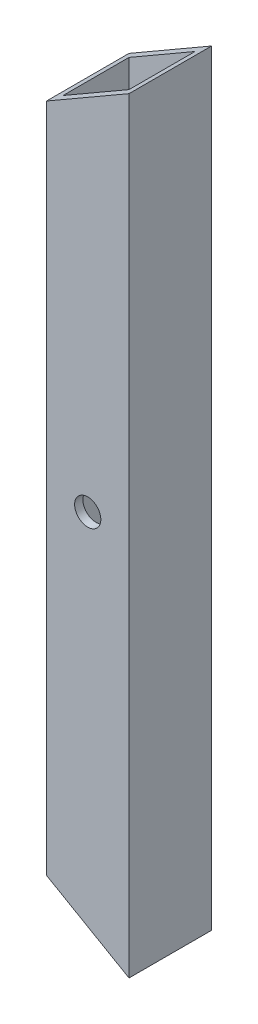
ISO-10303-21;
HEADER;
FILE_DESCRIPTION(('STEP AP214'),'2;1');
FILE_NAME('part.step','',(''),(''),'','','');
FILE_SCHEMA(('AUTOMOTIVE_DESIGN { 1 0 10303 214 1 1 1 1 }'));
ENDSEC;
DATA;
#1=APPLICATION_CONTEXT('core data for automotive mechanical design processes');
#2=APPLICATION_PROTOCOL_DEFINITION('international standard','automotive_design',2000,#1);
#3=PRODUCT_CONTEXT('',#1,'mechanical');
#4=PRODUCT('Part','Part','',(#3));
#5=PRODUCT_RELATED_PRODUCT_CATEGORY('part','',(#4));
#6=PRODUCT_DEFINITION_FORMATION('','',#4);
#7=PRODUCT_DEFINITION_CONTEXT('part definition',#1,'design');
#8=PRODUCT_DEFINITION('design','',#6,#7);
#9=PRODUCT_DEFINITION_SHAPE('','',#8);
#10=(LENGTH_UNIT() NAMED_UNIT(*) SI_UNIT(.MILLI.,.METRE.));
#11=(NAMED_UNIT(*) PLANE_ANGLE_UNIT() SI_UNIT($,.RADIAN.));
#12=(NAMED_UNIT(*) SI_UNIT($,.STERADIAN.) SOLID_ANGLE_UNIT());
#13=UNCERTAINTY_MEASURE_WITH_UNIT(LENGTH_MEASURE(1.E-05),#10,'distance_accuracy_value','');
#14=(GEOMETRIC_REPRESENTATION_CONTEXT(3) GLOBAL_UNCERTAINTY_ASSIGNED_CONTEXT((#13)) GLOBAL_UNIT_ASSIGNED_CONTEXT((#10,
#11,#12)) REPRESENTATION_CONTEXT('',''));
#15=CARTESIAN_POINT('',(0.,0.,0.));
#16=DIRECTION('',(0.,0.,1.));
#17=DIRECTION('',(1.,0.,0.));
#18=AXIS2_PLACEMENT_3D('',#15,#16,#17);
#19=CARTESIAN_POINT('',(239.29072497106,4.95437024738904E-12,26.9147395775252));
#20=DIRECTION('',(0.,0.,1.));
#21=DIRECTION('',(1.,0.,0.));
#22=AXIS2_PLACEMENT_3D('',#19,#20,#21);
#23=CYLINDRICAL_SURFACE('',#22,5.0419);
#24=CARTESIAN_POINT('',(239.29072497106,4.95437024738904E-12,28.575));
#25=DIRECTION('',(0.,0.,1.));
#26=DIRECTION('',(1.,0.,0.));
#27=AXIS2_PLACEMENT_3D('',#24,#25,#26);
#28=CIRCLE('',#27,5.0419);
#29=CARTESIAN_POINT('',(244.33262497106,4.95437024738904E-12,28.575));
#30=VERTEX_POINT('',#29);
#31=EDGE_CURVE('E119',#30,#30,#28,.T.);
#32=ORIENTED_EDGE('',*,*,#31,.F.);
#33=EDGE_LOOP('',(#32));
#34=FACE_BOUND('',#33,.T.);
#35=CARTESIAN_POINT('',(239.29072497106,4.95437024738904E-12,31.75));
#36=DIRECTION('',(0.,0.,1.));
#37=DIRECTION('',(1.,0.,0.));
#38=AXIS2_PLACEMENT_3D('',#35,#36,#37);
#39=CIRCLE('',#38,5.0419);
#40=CARTESIAN_POINT('',(244.33262497106,4.95437024738904E-12,31.75));
#41=VERTEX_POINT('',#40);
#42=EDGE_CURVE('E112',#41,#41,#39,.T.);
#43=ORIENTED_EDGE('',*,*,#42,.T.);
#44=EDGE_LOOP('',(#43));
#45=FACE_BOUND('',#44,.T.);
#46=ADVANCED_FACE('F17',(#34,#45),#23,.F.);
#47=CARTESIAN_POINT('',(239.29072497106,4.95437024738904E-12,26.9147395775252));
#48=DIRECTION('',(0.,0.,1.));
#49=DIRECTION('',(1.,0.,0.));
#50=AXIS2_PLACEMENT_3D('',#47,#48,#49);
#51=CYLINDRICAL_SURFACE('',#50,5.0419);
#52=CARTESIAN_POINT('',(239.29072497106,4.95437024738904E-12,0.));
#53=DIRECTION('',(0.,0.,1.));
#54=DIRECTION('',(1.,0.,0.));
#55=AXIS2_PLACEMENT_3D('',#52,#53,#54);
#56=CIRCLE('',#55,5.0419);
#57=CARTESIAN_POINT('',(244.33262497106,4.95437024738904E-12,0.));
#58=VERTEX_POINT('',#57);
#59=EDGE_CURVE('E121',#58,#58,#56,.T.);
#60=ORIENTED_EDGE('',*,*,#59,.F.);
#61=EDGE_LOOP('',(#60));
#62=FACE_BOUND('',#61,.T.);
#63=CARTESIAN_POINT('',(239.29072497106,4.95437024738904E-12,3.175));
#64=DIRECTION('',(0.,0.,1.));
#65=DIRECTION('',(1.,0.,0.));
#66=AXIS2_PLACEMENT_3D('',#63,#64,#65);
#67=CIRCLE('',#66,5.0419);
#68=CARTESIAN_POINT('',(244.33262497106,4.95437024738904E-12,3.175));
#69=VERTEX_POINT('',#68);
#70=EDGE_CURVE('E20',#69,#69,#67,.T.);
#71=ORIENTED_EDGE('',*,*,#70,.T.);
#72=EDGE_LOOP('',(#71));
#73=FACE_BOUND('',#72,.T.);
#74=ADVANCED_FACE('F135',(#62,#73),#51,.F.);
#75=CARTESIAN_POINT('',(223.415724971035,-500000.000000032,20.4770471900706));
#76=DIRECTION('',(-1.,0.,0.));
#77=DIRECTION('',(0.,0.,1.));
#78=AXIS2_PLACEMENT_3D('',#75,#76,#77);
#79=PLANE('',#78);
#80=DIRECTION('',(0.,0.,1.));
#81=VECTOR('',#80,1.);
#82=CARTESIAN_POINT('',(223.415724970858,128.989128953119,0.));
#83=LINE('',#82,#81);
#84=CARTESIAN_POINT('',(223.415724971033,128.989128953022,31.75));
#85=VERTEX_POINT('',#84);
#86=CARTESIAN_POINT('',(223.415724971005,128.989128952965,0.));
#87=VERTEX_POINT('',#86);
#88=EDGE_CURVE('E103',#85,#87,#83,.F.);
#89=ORIENTED_EDGE('',*,*,#88,.T.);
#90=DIRECTION('',(0.,1.,0.));
#91=VECTOR('',#90,1.);
#92=CARTESIAN_POINT('',(223.415724971111,-500000.000000032,0.));
#93=LINE('',#92,#91);
#94=CARTESIAN_POINT('',(223.415724971106,-128.98912895354,0.));
#95=VERTEX_POINT('',#94);
#96=EDGE_CURVE('E168',#95,#87,#93,.T.);
#97=ORIENTED_EDGE('',*,*,#96,.F.);
#98=DIRECTION('',(0.,0.,1.));
#99=VECTOR('',#98,1.);
#100=CARTESIAN_POINT('',(223.41572497125,-128.989128953345,0.));
#101=LINE('',#100,#99);
#102=CARTESIAN_POINT('',(223.415724971139,-128.989128953576,31.75));
#103=VERTEX_POINT('',#102);
#104=EDGE_CURVE('E164',#103,#95,#101,.F.);
#105=ORIENTED_EDGE('',*,*,#104,.F.);
#106=DIRECTION('',(0.,1.,0.));
#107=VECTOR('',#106,1.);
#108=CARTESIAN_POINT('',(223.415724971111,-500000.000000032,31.75));
#109=LINE('',#108,#107);
#110=EDGE_CURVE('E113',#103,#85,#109,.T.);
#111=ORIENTED_EDGE('',*,*,#110,.T.);
#112=EDGE_LOOP('',(#89,#97,#105,#111));
#113=FACE_BOUND('',#112,.T.);
#114=ADVANCED_FACE('F255',(#113),#79,.T.);
#115=CARTESIAN_POINT('',(237.348847091196,-500000.000000032,3.175));
#116=DIRECTION('',(0.,0.,-1.));
#117=DIRECTION('',(-1.,0.,0.));
#118=AXIS2_PLACEMENT_3D('',#115,#116,#117);
#119=PLANE('',#118);
#120=ORIENTED_EDGE('',*,*,#70,.F.);
#121=EDGE_LOOP('',(#120));
#122=FACE_BOUND('',#121,.T.);
#123=DIRECTION('',(0.,1.,0.));
#124=VECTOR('',#123,1.);
#125=CARTESIAN_POINT('',(251.99072497106,-500000.000000032,3.175));
#126=LINE('',#125,#124);
#127=CARTESIAN_POINT('',(251.990724970973,145.486912895044,3.175));
#128=VERTEX_POINT('',#127);
#129=CARTESIAN_POINT('',(251.990724971076,-145.486912895592,3.175));
#130=VERTEX_POINT('',#129);
#131=EDGE_CURVE('E101',#128,#130,#126,.F.);
#132=ORIENTED_EDGE('',*,*,#131,.F.);
#133=DIRECTION('',(0.866025403784429,0.500000000000017,0.));
#134=VECTOR('',#133,1.);
#135=CARTESIAN_POINT('',(127.58286248553,73.66,3.175));
#136=LINE('',#135,#134);
#137=CARTESIAN_POINT('',(226.59072497104,130.822216057713,3.175));
#138=VERTEX_POINT('',#137);
#139=EDGE_CURVE('E95',#128,#138,#136,.F.);
#140=ORIENTED_EDGE('',*,*,#139,.T.);
#141=DIRECTION('',(0.,1.,0.));
#142=VECTOR('',#141,1.);
#143=CARTESIAN_POINT('',(226.590724971035,-500000.000000032,3.175));
#144=LINE('',#143,#142);
#145=CARTESIAN_POINT('',(226.590724971127,-130.822216058214,3.175));
#146=VERTEX_POINT('',#145);
#147=EDGE_CURVE('E79',#138,#146,#144,.F.);
#148=ORIENTED_EDGE('',*,*,#147,.T.);
#149=DIRECTION('',(0.866025403784429,-0.500000000000017,0.));
#150=VECTOR('',#149,1.);
#151=CARTESIAN_POINT('',(127.58286248553,-73.66,3.175));
#152=LINE('',#151,#150);
#153=EDGE_CURVE('E161',#130,#146,#152,.F.);
#154=ORIENTED_EDGE('',*,*,#153,.F.);
#155=EDGE_LOOP('',(#132,#140,#148,#154));
#156=FACE_BOUND('',#155,.T.);
#157=ADVANCED_FACE('F100',(#122,#156),#119,.F.);
#158=CARTESIAN_POINT('',(226.590724971035,-500000.000000032,20.4770471900706));
#159=DIRECTION('',(-1.,0.,0.));
#160=DIRECTION('',(0.,0.,1.));
#161=AXIS2_PLACEMENT_3D('',#158,#159,#160);
#162=PLANE('',#161);
#163=ORIENTED_EDGE('',*,*,#147,.F.);
#164=DIRECTION('',(0.,0.,1.));
#165=VECTOR('',#164,1.);
#166=CARTESIAN_POINT('',(226.590724970861,130.822216057798,0.));
#167=LINE('',#166,#165);
#168=CARTESIAN_POINT('',(226.590724971015,130.822216057679,28.575));
#169=VERTEX_POINT('',#168);
#170=EDGE_CURVE('E83',#138,#169,#167,.T.);
#171=ORIENTED_EDGE('',*,*,#170,.T.);
#172=DIRECTION('',(0.,1.,0.));
#173=VECTOR('',#172,1.);
#174=CARTESIAN_POINT('',(226.590724971111,-500000.000000032,28.575));
#175=LINE('',#174,#173);
#176=CARTESIAN_POINT('',(226.590724971109,-130.822216058214,28.575));
#177=VERTEX_POINT('',#176);
#178=EDGE_CURVE('E88',#177,#169,#175,.T.);
#179=ORIENTED_EDGE('',*,*,#178,.F.);
#180=DIRECTION('',(0.,0.,1.));
#181=VECTOR('',#180,1.);
#182=CARTESIAN_POINT('',(226.590724971253,-130.822216058024,0.));
#183=LINE('',#182,#181);
#184=EDGE_CURVE('E84',#146,#177,#183,.T.);
#185=ORIENTED_EDGE('',*,*,#184,.F.);
#186=EDGE_LOOP('',(#163,#171,#179,#185));
#187=FACE_BOUND('',#186,.T.);
#188=ADVANCED_FACE('F81',(#187),#162,.F.);
#189=CARTESIAN_POINT('',(241.414785423032,-500000.000000032,28.575));
#190=DIRECTION('',(0.,0.,-1.));
#191=DIRECTION('',(-1.,0.,0.));
#192=AXIS2_PLACEMENT_3D('',#189,#190,#191);
#193=PLANE('',#192);
#194=ORIENTED_EDGE('',*,*,#31,.T.);
#195=EDGE_LOOP('',(#194));
#196=FACE_BOUND('',#195,.T.);
#197=DIRECTION('',(0.866025403784429,0.500000000000017,0.));
#198=VECTOR('',#197,1.);
#199=CARTESIAN_POINT('',(127.58286248553,73.66,28.575));
#200=LINE('',#199,#198);
#201=CARTESIAN_POINT('',(251.990724970971,145.486912895071,28.575));
#202=VERTEX_POINT('',#201);
#203=EDGE_CURVE('E98',#169,#202,#200,.T.);
#204=ORIENTED_EDGE('',*,*,#203,.T.);
#205=DIRECTION('',(0.,1.,0.));
#206=VECTOR('',#205,1.);
#207=CARTESIAN_POINT('',(251.99072497106,-500000.000000032,28.575));
#208=LINE('',#207,#206);
#209=CARTESIAN_POINT('',(251.990724971076,-145.486912895592,28.575));
#210=VERTEX_POINT('',#209);
#211=EDGE_CURVE('E117',#210,#202,#208,.T.);
#212=ORIENTED_EDGE('',*,*,#211,.F.);
#213=DIRECTION('',(0.866025403784429,-0.500000000000017,0.));
#214=VECTOR('',#213,1.);
#215=CARTESIAN_POINT('',(127.58286248553,-73.66,28.575));
#216=LINE('',#215,#214);
#217=EDGE_CURVE('E155',#177,#210,#216,.T.);
#218=ORIENTED_EDGE('',*,*,#217,.F.);
#219=ORIENTED_EDGE('',*,*,#178,.T.);
#220=EDGE_LOOP('',(#204,#212,#218,#219));
#221=FACE_BOUND('',#220,.T.);
#222=ADVANCED_FACE('F130',(#196,#221),#193,.T.);
#223=CARTESIAN_POINT('',(251.99072497106,-500000.000000032,20.4770471900706));
#224=DIRECTION('',(-1.,0.,0.));
#225=DIRECTION('',(0.,0.,1.));
#226=AXIS2_PLACEMENT_3D('',#223,#224,#225);
#227=PLANE('',#226);
#228=DIRECTION('',(0.,0.,1.));
#229=VECTOR('',#228,1.);
#230=CARTESIAN_POINT('',(251.990724970865,145.486912895217,0.));
#231=LINE('',#230,#229);
#232=EDGE_CURVE('E170',#202,#128,#231,.F.);
#233=ORIENTED_EDGE('',*,*,#232,.T.);
#234=ORIENTED_EDGE('',*,*,#131,.T.);
#235=DIRECTION('',(0.,0.,1.));
#236=VECTOR('',#235,1.);
#237=CARTESIAN_POINT('',(251.990724971287,-145.486912895461,0.));
#238=LINE('',#237,#236);
#239=EDGE_CURVE('E150',#210,#130,#238,.F.);
#240=ORIENTED_EDGE('',*,*,#239,.F.);
#241=ORIENTED_EDGE('',*,*,#211,.T.);
#242=EDGE_LOOP('',(#233,#234,#240,#241));
#243=FACE_BOUND('',#242,.T.);
#244=ADVANCED_FACE('F141',(#243),#227,.T.);
#245=CARTESIAN_POINT('',(241.414785423032,-500000.000000032,31.75));
#246=DIRECTION('',(0.,0.,-1.));
#247=DIRECTION('',(-1.,0.,0.));
#248=AXIS2_PLACEMENT_3D('',#245,#246,#247);
#249=PLANE('',#248);
#250=ORIENTED_EDGE('',*,*,#42,.F.);
#251=EDGE_LOOP('',(#250));
#252=FACE_BOUND('',#251,.T.);
#253=DIRECTION('',(0.,1.,0.));
#254=VECTOR('',#253,1.);
#255=CARTESIAN_POINT('',(255.16572497106,-500000.000000032,31.75));
#256=LINE('',#255,#254);
#257=CARTESIAN_POINT('',(255.165724971107,-147.320000000326,31.75));
#258=VERTEX_POINT('',#257);
#259=CARTESIAN_POINT('',(255.165724971024,147.31999999971,31.75));
#260=VERTEX_POINT('',#259);
#261=EDGE_CURVE('E145',#258,#260,#256,.T.);
#262=ORIENTED_EDGE('',*,*,#261,.T.);
#263=DIRECTION('',(0.866025403784429,0.500000000000017,0.));
#264=VECTOR('',#263,1.);
#265=CARTESIAN_POINT('',(127.58286248553,73.66,31.75));
#266=LINE('',#265,#264);
#267=EDGE_CURVE('E106',#260,#85,#266,.F.);
#268=ORIENTED_EDGE('',*,*,#267,.T.);
#269=ORIENTED_EDGE('',*,*,#110,.F.);
#270=DIRECTION('',(0.866025403784429,-0.500000000000017,0.));
#271=VECTOR('',#270,1.);
#272=CARTESIAN_POINT('',(127.58286248553,-73.66,31.75));
#273=LINE('',#272,#271);
#274=EDGE_CURVE('E124',#258,#103,#273,.F.);
#275=ORIENTED_EDGE('',*,*,#274,.F.);
#276=EDGE_LOOP('',(#262,#268,#269,#275));
#277=FACE_BOUND('',#276,.T.);
#278=ADVANCED_FACE('F138',(#252,#277),#249,.F.);
#279=CARTESIAN_POINT('',(127.58286248553,73.66,0.));
#280=DIRECTION('',(0.500000000000017,-0.866025403784429,0.));
#281=DIRECTION('',(0.866025403784429,0.500000000000017,0.));
#282=AXIS2_PLACEMENT_3D('',#279,#280,#281);
#283=PLANE('',#282);
#284=ORIENTED_EDGE('',*,*,#203,.F.);
#285=ORIENTED_EDGE('',*,*,#170,.F.);
#286=ORIENTED_EDGE('',*,*,#139,.F.);
#287=ORIENTED_EDGE('',*,*,#232,.F.);
#288=EDGE_LOOP('',(#284,#285,#286,#287));
#289=FACE_BOUND('',#288,.T.);
#290=ORIENTED_EDGE('',*,*,#88,.F.);
#291=ORIENTED_EDGE('',*,*,#267,.F.);
#292=DIRECTION('',(0.,0.,1.));
#293=VECTOR('',#292,1.);
#294=CARTESIAN_POINT('',(255.16572497106,147.319999999638,20.4770471900706));
#295=LINE('',#294,#293);
#296=CARTESIAN_POINT('',(255.165724970982,147.319999999778,0.));
#297=VERTEX_POINT('',#296);
#298=EDGE_CURVE('E149',#260,#297,#295,.F.);
#299=ORIENTED_EDGE('',*,*,#298,.T.);
#300=DIRECTION('',(0.86602540378495,0.499999999999115,0.));
#301=VECTOR('',#300,1.);
#302=CARTESIAN_POINT('',(223.415724970984,128.989128952867,0.));
#303=LINE('',#302,#301);
#304=EDGE_CURVE('E125',#87,#297,#303,.T.);
#305=ORIENTED_EDGE('',*,*,#304,.F.);
#306=EDGE_LOOP('',(#290,#291,#299,#305));
#307=FACE_BOUND('',#306,.T.);
#308=ADVANCED_FACE('F92',(#289,#307),#283,.F.);
#309=CARTESIAN_POINT('',(237.348847091196,-500000.000000032,0.));
#310=DIRECTION('',(0.,0.,-1.));
#311=DIRECTION('',(-1.,0.,0.));
#312=AXIS2_PLACEMENT_3D('',#309,#310,#311);
#313=PLANE('',#312);
#314=ORIENTED_EDGE('',*,*,#59,.T.);
#315=EDGE_LOOP('',(#314));
#316=FACE_BOUND('',#315,.T.);
#317=ORIENTED_EDGE('',*,*,#304,.T.);
#318=DIRECTION('',(0.,1.,0.));
#319=VECTOR('',#318,1.);
#320=CARTESIAN_POINT('',(255.16572497106,-500000.000000032,0.));
#321=LINE('',#320,#319);
#322=CARTESIAN_POINT('',(255.165724971095,-147.320000000262,0.));
#323=VERTEX_POINT('',#322);
#324=EDGE_CURVE('E26',#297,#323,#321,.F.);
#325=ORIENTED_EDGE('',*,*,#324,.T.);
#326=DIRECTION('',(0.866025403784429,-0.500000000000017,0.));
#327=VECTOR('',#326,1.);
#328=CARTESIAN_POINT('',(127.58286248553,-73.66,0.));
#329=LINE('',#328,#327);
#330=EDGE_CURVE('E34',#95,#323,#329,.T.);
#331=ORIENTED_EDGE('',*,*,#330,.F.);
#332=ORIENTED_EDGE('',*,*,#96,.T.);
#333=EDGE_LOOP('',(#317,#325,#331,#332));
#334=FACE_BOUND('',#333,.T.);
#335=ADVANCED_FACE('F190',(#316,#334),#313,.T.);
#336=CARTESIAN_POINT('',(127.58286248553,-73.66,0.));
#337=DIRECTION('',(-0.500000000000017,-0.866025403784429,0.));
#338=DIRECTION('',(0.866025403784429,-0.500000000000017,0.));
#339=AXIS2_PLACEMENT_3D('',#336,#337,#338);
#340=PLANE('',#339);
#341=ORIENTED_EDGE('',*,*,#217,.T.);
#342=ORIENTED_EDGE('',*,*,#239,.T.);
#343=ORIENTED_EDGE('',*,*,#153,.T.);
#344=ORIENTED_EDGE('',*,*,#184,.T.);
#345=EDGE_LOOP('',(#341,#342,#343,#344));
#346=FACE_BOUND('',#345,.T.);
#347=ORIENTED_EDGE('',*,*,#104,.T.);
#348=ORIENTED_EDGE('',*,*,#330,.T.);
#349=DIRECTION('',(0.,0.,1.));
#350=VECTOR('',#349,1.);
#351=CARTESIAN_POINT('',(255.16572497106,-147.32000000032,20.4770471900706));
#352=LINE('',#351,#350);
#353=EDGE_CURVE('E11',#323,#258,#352,.T.);
#354=ORIENTED_EDGE('',*,*,#353,.T.);
#355=ORIENTED_EDGE('',*,*,#274,.T.);
#356=EDGE_LOOP('',(#347,#348,#354,#355));
#357=FACE_BOUND('',#356,.T.);
#358=ADVANCED_FACE('F175',(#346,#357),#340,.T.);
#359=CARTESIAN_POINT('',(255.16572497106,-500000.000000032,20.4770471900706));
#360=DIRECTION('',(-1.,0.,0.));
#361=DIRECTION('',(0.,0.,1.));
#362=AXIS2_PLACEMENT_3D('',#359,#360,#361);
#363=PLANE('',#362);
#364=ORIENTED_EDGE('',*,*,#324,.F.);
#365=ORIENTED_EDGE('',*,*,#298,.F.);
#366=ORIENTED_EDGE('',*,*,#261,.F.);
#367=ORIENTED_EDGE('',*,*,#353,.F.);
#368=EDGE_LOOP('',(#364,#365,#366,#367));
#369=FACE_BOUND('',#368,.T.);
#370=ADVANCED_FACE('F184',(#369),#363,.F.);
#371=CLOSED_SHELL('',(#46,#74,#114,#157,#188,#222,#244,#278,#308,#335,#358,#370));
#372=MANIFOLD_SOLID_BREP('B1',#371);
#373=ADVANCED_BREP_SHAPE_REPRESENTATION('',(#18,#372),#14);
#374=SHAPE_DEFINITION_REPRESENTATION(#9,#373);
ENDSEC;
END-ISO-10303-21;
